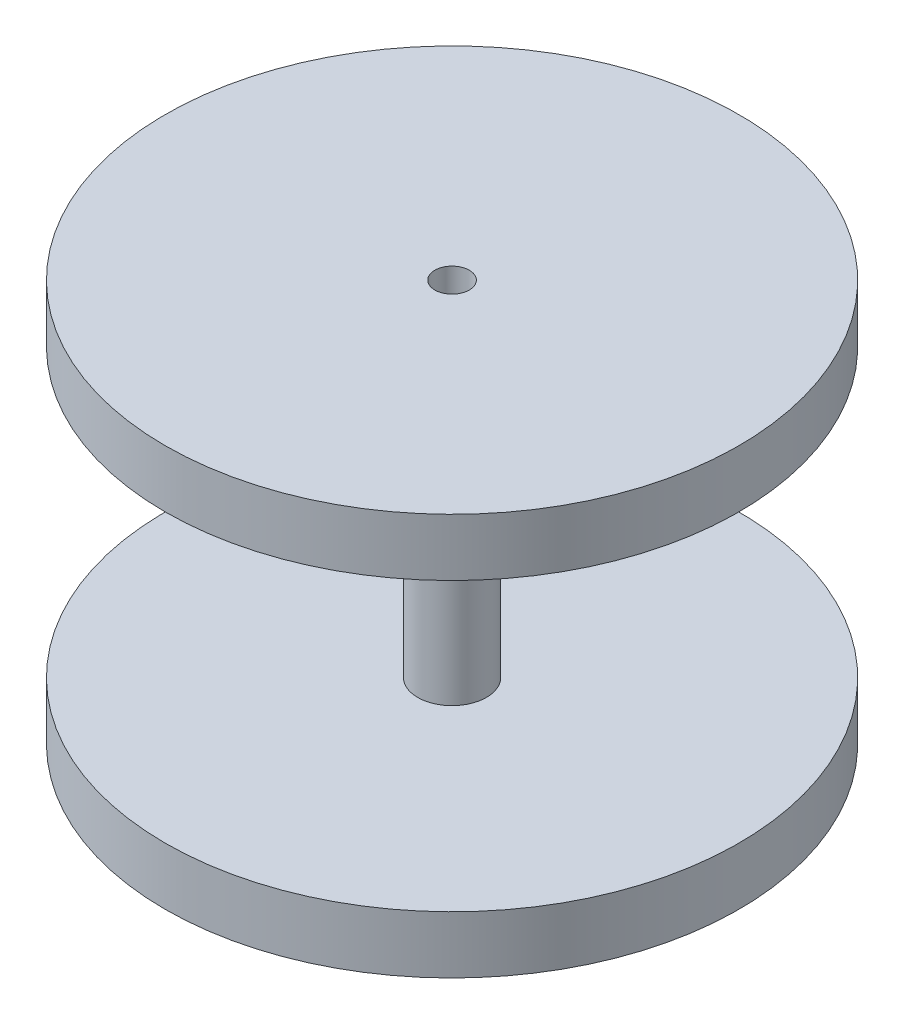
ISO-10303-21;
HEADER;
FILE_DESCRIPTION(('STEP AP214'),'2;1');
FILE_NAME('part.step','',(''),(''),'','','');
FILE_SCHEMA(('AUTOMOTIVE_DESIGN { 1 0 10303 214 1 1 1 1 }'));
ENDSEC;
DATA;
#1=APPLICATION_CONTEXT('core data for automotive mechanical design processes');
#2=APPLICATION_PROTOCOL_DEFINITION('international standard','automotive_design',2000,#1);
#3=PRODUCT_CONTEXT('',#1,'mechanical');
#4=PRODUCT('Part','Part','',(#3));
#5=PRODUCT_RELATED_PRODUCT_CATEGORY('part','',(#4));
#6=PRODUCT_DEFINITION_FORMATION('','',#4);
#7=PRODUCT_DEFINITION_CONTEXT('part definition',#1,'design');
#8=PRODUCT_DEFINITION('design','',#6,#7);
#9=PRODUCT_DEFINITION_SHAPE('','',#8);
#10=(LENGTH_UNIT() NAMED_UNIT(*) SI_UNIT(.MILLI.,.METRE.));
#11=(NAMED_UNIT(*) PLANE_ANGLE_UNIT() SI_UNIT($,.RADIAN.));
#12=(NAMED_UNIT(*) SI_UNIT($,.STERADIAN.) SOLID_ANGLE_UNIT());
#13=UNCERTAINTY_MEASURE_WITH_UNIT(LENGTH_MEASURE(1.E-05),#10,'distance_accuracy_value','');
#14=(GEOMETRIC_REPRESENTATION_CONTEXT(3) GLOBAL_UNCERTAINTY_ASSIGNED_CONTEXT((#13)) GLOBAL_UNIT_ASSIGNED_CONTEXT((#10,
#11,#12)) REPRESENTATION_CONTEXT('',''));
#15=CARTESIAN_POINT('',(0.,0.,0.));
#16=DIRECTION('',(0.,0.,1.));
#17=DIRECTION('',(1.,0.,0.));
#18=AXIS2_PLACEMENT_3D('',#15,#16,#17);
#19=CARTESIAN_POINT('',(0.,5.,0.));
#20=DIRECTION('',(0.,-1.,0.));
#21=DIRECTION('',(0.,0.,-1.));
#22=AXIS2_PLACEMENT_3D('',#19,#20,#21);
#23=CYLINDRICAL_SURFACE('',#22,25.);
#24=CARTESIAN_POINT('',(0.,5.,0.));
#25=DIRECTION('',(0.,1.,0.));
#26=DIRECTION('',(0.,0.,1.));
#27=AXIS2_PLACEMENT_3D('',#24,#25,#26);
#28=CIRCLE('',#27,25.);
#29=CARTESIAN_POINT('',(0.,5.,25.));
#30=VERTEX_POINT('',#29);
#31=EDGE_CURVE('E10',#30,#30,#28,.T.);
#32=ORIENTED_EDGE('',*,*,#31,.F.);
#33=EDGE_LOOP('',(#32));
#34=FACE_BOUND('',#33,.T.);
#35=CARTESIAN_POINT('',(0.,0.,0.));
#36=DIRECTION('',(0.,1.,0.));
#37=DIRECTION('',(0.,0.,1.));
#38=AXIS2_PLACEMENT_3D('',#35,#36,#37);
#39=CIRCLE('',#38,25.);
#40=CARTESIAN_POINT('',(0.,0.,25.));
#41=VERTEX_POINT('',#40);
#42=EDGE_CURVE('E34',#41,#41,#39,.T.);
#43=ORIENTED_EDGE('',*,*,#42,.T.);
#44=EDGE_LOOP('',(#43));
#45=FACE_BOUND('',#44,.T.);
#46=ADVANCED_FACE('F31',(#34,#45),#23,.T.);
#47=CARTESIAN_POINT('',(0.,5.,0.));
#48=DIRECTION('',(0.,1.,0.));
#49=DIRECTION('',(0.,0.,1.));
#50=AXIS2_PLACEMENT_3D('',#47,#48,#49);
#51=PLANE('',#50);
#52=CARTESIAN_POINT('',(0.,5.,0.));
#53=DIRECTION('',(0.,1.,0.));
#54=DIRECTION('',(0.,0.,1.));
#55=AXIS2_PLACEMENT_3D('',#52,#53,#54);
#56=CIRCLE('',#55,3.);
#57=CARTESIAN_POINT('',(0.,5.,3.));
#58=VERTEX_POINT('',#57);
#59=EDGE_CURVE('E43',#58,#58,#56,.T.);
#60=ORIENTED_EDGE('',*,*,#59,.F.);
#61=EDGE_LOOP('',(#60));
#62=FACE_BOUND('',#61,.T.);
#63=ORIENTED_EDGE('',*,*,#31,.T.);
#64=EDGE_LOOP('',(#63));
#65=FACE_BOUND('',#64,.T.);
#66=ADVANCED_FACE('F90',(#62,#65),#51,.T.);
#67=CARTESIAN_POINT('',(0.,0.,0.));
#68=DIRECTION('',(0.,1.,0.));
#69=DIRECTION('',(0.,0.,1.));
#70=AXIS2_PLACEMENT_3D('',#67,#68,#69);
#71=PLANE('',#70);
#72=CARTESIAN_POINT('',(0.,0.,0.));
#73=DIRECTION('',(0.,1.,0.));
#74=DIRECTION('',(0.,0.,1.));
#75=AXIS2_PLACEMENT_3D('',#72,#73,#74);
#76=CIRCLE('',#75,1.5);
#77=CARTESIAN_POINT('',(0.,0.,1.5));
#78=VERTEX_POINT('',#77);
#79=EDGE_CURVE('E52',#78,#78,#76,.T.);
#80=ORIENTED_EDGE('',*,*,#79,.T.);
#81=EDGE_LOOP('',(#80));
#82=FACE_BOUND('',#81,.T.);
#83=ORIENTED_EDGE('',*,*,#42,.F.);
#84=EDGE_LOOP('',(#83));
#85=FACE_BOUND('',#84,.T.);
#86=ADVANCED_FACE('F61',(#82,#85),#71,.F.);
#87=CARTESIAN_POINT('',(0.,30.,0.));
#88=DIRECTION('',(0.,-1.,0.));
#89=DIRECTION('',(0.,0.,-1.));
#90=AXIS2_PLACEMENT_3D('',#87,#88,#89);
#91=CYLINDRICAL_SURFACE('',#90,3.);
#92=CARTESIAN_POINT('',(0.,30.,0.));
#93=DIRECTION('',(0.,1.,0.));
#94=DIRECTION('',(0.,0.,1.));
#95=AXIS2_PLACEMENT_3D('',#92,#93,#94);
#96=CIRCLE('',#95,3.);
#97=CARTESIAN_POINT('',(0.,30.,3.));
#98=VERTEX_POINT('',#97);
#99=EDGE_CURVE('E41',#98,#98,#96,.T.);
#100=ORIENTED_EDGE('',*,*,#99,.F.);
#101=EDGE_LOOP('',(#100));
#102=FACE_BOUND('',#101,.T.);
#103=ORIENTED_EDGE('',*,*,#59,.T.);
#104=EDGE_LOOP('',(#103));
#105=FACE_BOUND('',#104,.T.);
#106=ADVANCED_FACE('F80',(#102,#105),#91,.T.);
#107=CARTESIAN_POINT('',(0.,35.,0.));
#108=DIRECTION('',(0.,-1.,0.));
#109=DIRECTION('',(0.,0.,-1.));
#110=AXIS2_PLACEMENT_3D('',#107,#108,#109);
#111=CYLINDRICAL_SURFACE('',#110,25.);
#112=CARTESIAN_POINT('',(0.,35.,0.));
#113=DIRECTION('',(0.,1.,0.));
#114=DIRECTION('',(0.,0.,1.));
#115=AXIS2_PLACEMENT_3D('',#112,#113,#114);
#116=CIRCLE('',#115,25.);
#117=CARTESIAN_POINT('',(0.,35.,25.));
#118=VERTEX_POINT('',#117);
#119=EDGE_CURVE('E46',#118,#118,#116,.T.);
#120=ORIENTED_EDGE('',*,*,#119,.F.);
#121=EDGE_LOOP('',(#120));
#122=FACE_BOUND('',#121,.T.);
#123=CARTESIAN_POINT('',(0.,30.,0.));
#124=DIRECTION('',(0.,1.,0.));
#125=DIRECTION('',(0.,0.,1.));
#126=AXIS2_PLACEMENT_3D('',#123,#124,#125);
#127=CIRCLE('',#126,25.);
#128=CARTESIAN_POINT('',(0.,30.,25.));
#129=VERTEX_POINT('',#128);
#130=EDGE_CURVE('E49',#129,#129,#127,.T.);
#131=ORIENTED_EDGE('',*,*,#130,.T.);
#132=EDGE_LOOP('',(#131));
#133=FACE_BOUND('',#132,.T.);
#134=ADVANCED_FACE('F74',(#122,#133),#111,.T.);
#135=CARTESIAN_POINT('',(0.,35.,0.));
#136=DIRECTION('',(0.,1.,0.));
#137=DIRECTION('',(0.,0.,1.));
#138=AXIS2_PLACEMENT_3D('',#135,#136,#137);
#139=PLANE('',#138);
#140=CARTESIAN_POINT('',(0.,35.,0.));
#141=DIRECTION('',(0.,1.,0.));
#142=DIRECTION('',(0.,0.,1.));
#143=AXIS2_PLACEMENT_3D('',#140,#141,#142);
#144=CIRCLE('',#143,1.5);
#145=CARTESIAN_POINT('',(0.,35.,1.5));
#146=VERTEX_POINT('',#145);
#147=EDGE_CURVE('E55',#146,#146,#144,.T.);
#148=ORIENTED_EDGE('',*,*,#147,.F.);
#149=EDGE_LOOP('',(#148));
#150=FACE_BOUND('',#149,.T.);
#151=ORIENTED_EDGE('',*,*,#119,.T.);
#152=EDGE_LOOP('',(#151));
#153=FACE_BOUND('',#152,.T.);
#154=ADVANCED_FACE('F71',(#150,#153),#139,.T.);
#155=CARTESIAN_POINT('',(0.,30.,0.));
#156=DIRECTION('',(0.,1.,0.));
#157=DIRECTION('',(0.,0.,1.));
#158=AXIS2_PLACEMENT_3D('',#155,#156,#157);
#159=PLANE('',#158);
#160=ORIENTED_EDGE('',*,*,#99,.T.);
#161=EDGE_LOOP('',(#160));
#162=FACE_BOUND('',#161,.T.);
#163=ORIENTED_EDGE('',*,*,#130,.F.);
#164=EDGE_LOOP('',(#163));
#165=FACE_BOUND('',#164,.T.);
#166=ADVANCED_FACE('F67',(#162,#165),#159,.F.);
#167=CARTESIAN_POINT('',(0.,0.,0.));
#168=DIRECTION('',(0.,1.,0.));
#169=DIRECTION('',(0.,0.,1.));
#170=AXIS2_PLACEMENT_3D('',#167,#168,#169);
#171=CYLINDRICAL_SURFACE('',#170,1.5);
#172=ORIENTED_EDGE('',*,*,#79,.F.);
#173=EDGE_LOOP('',(#172));
#174=FACE_BOUND('',#173,.T.);
#175=ORIENTED_EDGE('',*,*,#147,.T.);
#176=EDGE_LOOP('',(#175));
#177=FACE_BOUND('',#176,.T.);
#178=ADVANCED_FACE('F64',(#174,#177),#171,.F.);
#179=CLOSED_SHELL('',(#46,#66,#86,#106,#134,#154,#166,#178));
#180=MANIFOLD_SOLID_BREP('B2',#179);
#181=ADVANCED_BREP_SHAPE_REPRESENTATION('',(#18,#180),#14);
#182=SHAPE_DEFINITION_REPRESENTATION(#9,#181);
ENDSEC;
END-ISO-10303-21;
